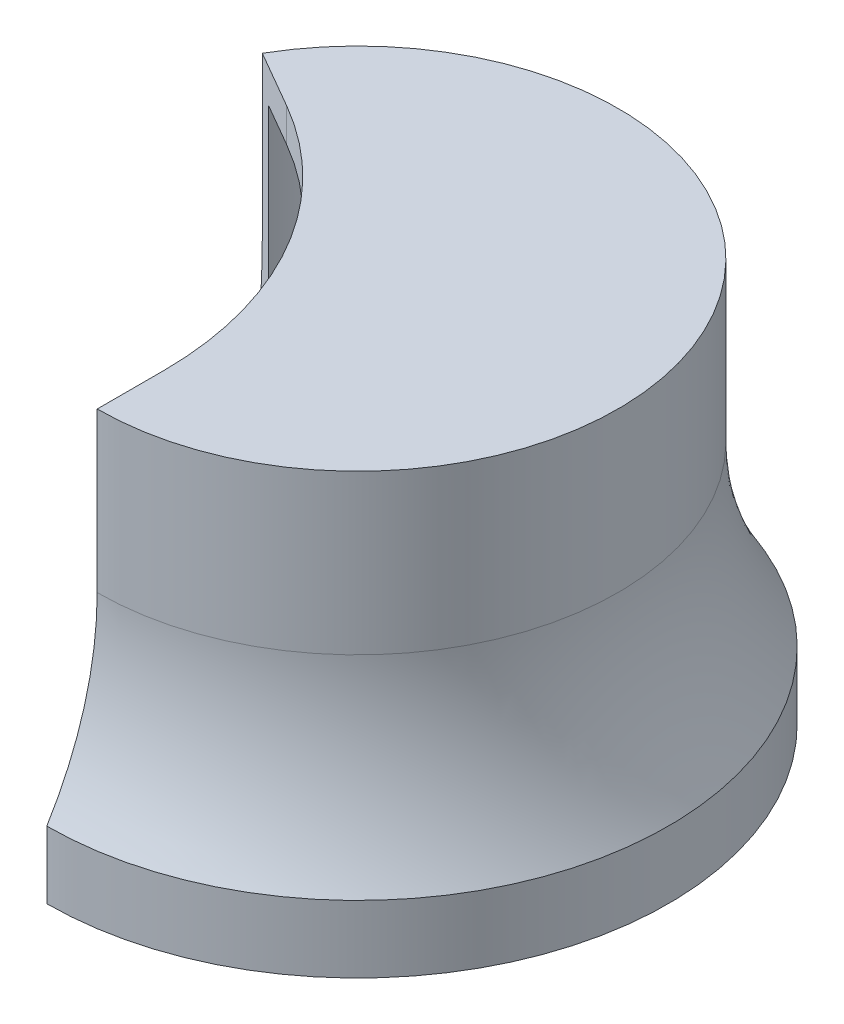
ISO-10303-21;
HEADER;
FILE_DESCRIPTION(('STEP AP214'),'2;1');
FILE_NAME('part.step','',(''),(''),'','','');
FILE_SCHEMA(('AUTOMOTIVE_DESIGN { 1 0 10303 214 1 1 1 1 }'));
ENDSEC;
DATA;
#1=APPLICATION_CONTEXT('core data for automotive mechanical design processes');
#2=APPLICATION_PROTOCOL_DEFINITION('international standard','automotive_design',2000,#1);
#3=PRODUCT_CONTEXT('',#1,'mechanical');
#4=PRODUCT('Part','Part','',(#3));
#5=PRODUCT_RELATED_PRODUCT_CATEGORY('part','',(#4));
#6=PRODUCT_DEFINITION_FORMATION('','',#4);
#7=PRODUCT_DEFINITION_CONTEXT('part definition',#1,'design');
#8=PRODUCT_DEFINITION('design','',#6,#7);
#9=PRODUCT_DEFINITION_SHAPE('','',#8);
#10=(LENGTH_UNIT() NAMED_UNIT(*) SI_UNIT(.MILLI.,.METRE.));
#11=(NAMED_UNIT(*) PLANE_ANGLE_UNIT() SI_UNIT($,.RADIAN.));
#12=(NAMED_UNIT(*) SI_UNIT($,.STERADIAN.) SOLID_ANGLE_UNIT());
#13=UNCERTAINTY_MEASURE_WITH_UNIT(LENGTH_MEASURE(1.E-05),#10,'distance_accuracy_value','');
#14=(GEOMETRIC_REPRESENTATION_CONTEXT(3) GLOBAL_UNCERTAINTY_ASSIGNED_CONTEXT((#13)) GLOBAL_UNIT_ASSIGNED_CONTEXT((#10,
#11,#12)) REPRESENTATION_CONTEXT('',''));
#15=CARTESIAN_POINT('',(0.,0.,0.));
#16=DIRECTION('',(0.,0.,1.));
#17=DIRECTION('',(1.,0.,0.));
#18=AXIS2_PLACEMENT_3D('',#15,#16,#17);
#19=CARTESIAN_POINT('',(0.,0.,0.));
#20=DIRECTION('',(0.,1.,0.));
#21=DIRECTION('',(0.,0.,1.));
#22=AXIS2_PLACEMENT_3D('',#19,#20,#21);
#23=PLANE('',#22);
#24=DIRECTION('',(0.,0.,1.));
#25=VECTOR('',#24,1.);
#26=CARTESIAN_POINT('',(0.,0.,0.));
#27=LINE('',#26,#25);
#28=CARTESIAN_POINT('',(0.,0.,14.5));
#29=VERTEX_POINT('',#28);
#30=CARTESIAN_POINT('',(0.,0.,17.));
#31=VERTEX_POINT('',#30);
#32=EDGE_CURVE('E138',#29,#31,#27,.T.);
#33=ORIENTED_EDGE('',*,*,#32,.F.);
#34=CARTESIAN_POINT('',(0.,0.,0.));
#35=DIRECTION('',(0.,1.,0.));
#36=DIRECTION('',(0.,0.,1.));
#37=AXIS2_PLACEMENT_3D('',#34,#35,#36);
#38=CIRCLE('',#37,14.5);
#39=CARTESIAN_POINT('',(-12.5573683548743,0.,-7.25000000000006));
#40=VERTEX_POINT('',#39);
#41=EDGE_CURVE('E133',#29,#40,#38,.T.);
#42=ORIENTED_EDGE('',*,*,#41,.T.);
#43=DIRECTION('',(-0.866025403784436,0.,-0.500000000000004));
#44=VECTOR('',#43,1.);
#45=CARTESIAN_POINT('',(0.,0.,0.));
#46=LINE('',#45,#44);
#47=CARTESIAN_POINT('',(-14.7224318643354,0.,-8.50000000000007));
#48=VERTEX_POINT('',#47);
#49=EDGE_CURVE('E116',#40,#48,#46,.T.);
#50=ORIENTED_EDGE('',*,*,#49,.T.);
#51=CARTESIAN_POINT('',(0.,0.,0.));
#52=DIRECTION('',(0.,1.,0.));
#53=DIRECTION('',(0.,0.,1.));
#54=AXIS2_PLACEMENT_3D('',#51,#52,#53);
#55=CIRCLE('',#54,17.);
#56=EDGE_CURVE('E143',#31,#48,#55,.T.);
#57=ORIENTED_EDGE('',*,*,#56,.F.);
#58=EDGE_LOOP('',(#33,#42,#50,#57));
#59=FACE_BOUND('',#58,.T.);
#60=ADVANCED_FACE('F41',(#59),#23,.F.);
#61=CARTESIAN_POINT('',(0.,2.,0.));
#62=DIRECTION('',(0.,-1.,0.));
#63=DIRECTION('',(0.,0.,-1.));
#64=AXIS2_PLACEMENT_3D('',#61,#62,#63);
#65=CYLINDRICAL_SURFACE('',#64,18.5);
#66=DIRECTION('',(0.,-1.,0.));
#67=VECTOR('',#66,1.);
#68=CARTESIAN_POINT('',(0.,2.,18.5));
#69=LINE('',#68,#67);
#70=CARTESIAN_POINT('',(0.,-2.,18.5));
#71=VERTEX_POINT('',#70);
#72=CARTESIAN_POINT('',(0.,2.,18.5));
#73=VERTEX_POINT('',#72);
#74=EDGE_CURVE('E187',#71,#73,#69,.F.);
#75=ORIENTED_EDGE('',*,*,#74,.F.);
#76=CARTESIAN_POINT('',(0.,-2.,0.));
#77=DIRECTION('',(0.,1.,0.));
#78=DIRECTION('',(0.,0.,1.));
#79=AXIS2_PLACEMENT_3D('',#76,#77,#78);
#80=CIRCLE('',#79,18.5);
#81=CARTESIAN_POINT('',(-16.0214699700121,-2.,-9.25000000000007));
#82=VERTEX_POINT('',#81);
#83=EDGE_CURVE('E140',#71,#82,#80,.T.);
#84=ORIENTED_EDGE('',*,*,#83,.T.);
#85=DIRECTION('',(0.,-1.,0.));
#86=VECTOR('',#85,1.);
#87=CARTESIAN_POINT('',(-16.0214699700121,2.,-9.25000000000007));
#88=LINE('',#87,#86);
#89=CARTESIAN_POINT('',(-16.0214699700121,2.,-9.25000000000007));
#90=VERTEX_POINT('',#89);
#91=EDGE_CURVE('E205',#82,#90,#88,.F.);
#92=ORIENTED_EDGE('',*,*,#91,.T.);
#93=CARTESIAN_POINT('',(0.,2.,0.));
#94=DIRECTION('',(0.,1.,0.));
#95=DIRECTION('',(0.,0.,1.));
#96=AXIS2_PLACEMENT_3D('',#93,#94,#95);
#97=CIRCLE('',#96,18.5);
#98=EDGE_CURVE('E139',#73,#90,#97,.T.);
#99=ORIENTED_EDGE('',*,*,#98,.F.);
#100=EDGE_LOOP('',(#75,#84,#92,#99));
#101=FACE_BOUND('',#100,.T.);
#102=ADVANCED_FACE('F220',(#101),#65,.T.);
#103=CARTESIAN_POINT('',(0.,2.,0.));
#104=DIRECTION('',(0.,-1.,0.));
#105=DIRECTION('',(0.,0.,-1.));
#106=AXIS2_PLACEMENT_3D('',#103,#104,#105);
#107=CYLINDRICAL_SURFACE('',#106,14.5);
#108=ORIENTED_EDGE('',*,*,#41,.F.);
#109=DIRECTION('',(0.,-1.,0.));
#110=VECTOR('',#109,1.);
#111=CARTESIAN_POINT('',(0.,2.,14.5));
#112=LINE('',#111,#110);
#113=CARTESIAN_POINT('',(0.,20.,14.5));
#114=VERTEX_POINT('',#113);
#115=EDGE_CURVE('E213',#29,#114,#112,.F.);
#116=ORIENTED_EDGE('',*,*,#115,.T.);
#117=CARTESIAN_POINT('',(0.,20.,0.));
#118=DIRECTION('',(0.,1.,0.));
#119=DIRECTION('',(0.,0.,1.));
#120=AXIS2_PLACEMENT_3D('',#117,#118,#119);
#121=CIRCLE('',#120,14.5);
#122=CARTESIAN_POINT('',(-12.5573683548743,20.,-7.25000000000006));
#123=VERTEX_POINT('',#122);
#124=EDGE_CURVE('E135',#114,#123,#121,.T.);
#125=ORIENTED_EDGE('',*,*,#124,.T.);
#126=DIRECTION('',(0.,-1.,0.));
#127=VECTOR('',#126,1.);
#128=CARTESIAN_POINT('',(-12.5573683548743,2.,-7.25000000000006));
#129=LINE('',#128,#127);
#130=EDGE_CURVE('E120',#40,#123,#129,.F.);
#131=ORIENTED_EDGE('',*,*,#130,.F.);
#132=EDGE_LOOP('',(#108,#116,#125,#131));
#133=FACE_BOUND('',#132,.T.);
#134=ADVANCED_FACE('F131',(#133),#107,.F.);
#135=CARTESIAN_POINT('',(0.,-2.,0.));
#136=DIRECTION('',(0.,1.,0.));
#137=DIRECTION('',(0.,0.,1.));
#138=AXIS2_PLACEMENT_3D('',#135,#136,#137);
#139=CYLINDRICAL_SURFACE('',#138,17.);
#140=DIRECTION('',(0.,1.,0.));
#141=VECTOR('',#140,1.);
#142=CARTESIAN_POINT('',(0.,-2.,17.));
#143=LINE('',#142,#141);
#144=CARTESIAN_POINT('',(0.,-2.,17.));
#145=VERTEX_POINT('',#144);
#146=EDGE_CURVE('E203',#31,#145,#143,.F.);
#147=ORIENTED_EDGE('',*,*,#146,.F.);
#148=ORIENTED_EDGE('',*,*,#56,.T.);
#149=DIRECTION('',(0.,1.,0.));
#150=VECTOR('',#149,1.);
#151=CARTESIAN_POINT('',(-14.7224318643354,-2.,-8.50000000000007));
#152=LINE('',#151,#150);
#153=CARTESIAN_POINT('',(-14.7224318643354,-2.,-8.50000000000007));
#154=VERTEX_POINT('',#153);
#155=EDGE_CURVE('E123',#48,#154,#152,.F.);
#156=ORIENTED_EDGE('',*,*,#155,.T.);
#157=CARTESIAN_POINT('',(0.,-2.,0.));
#158=DIRECTION('',(0.,1.,0.));
#159=DIRECTION('',(0.,0.,1.));
#160=AXIS2_PLACEMENT_3D('',#157,#158,#159);
#161=CIRCLE('',#160,17.);
#162=EDGE_CURVE('E146',#145,#154,#161,.T.);
#163=ORIENTED_EDGE('',*,*,#162,.F.);
#164=EDGE_LOOP('',(#147,#148,#156,#163));
#165=FACE_BOUND('',#164,.T.);
#166=ADVANCED_FACE('F202',(#165),#139,.F.);
#167=CARTESIAN_POINT('',(0.,-2.,0.));
#168=DIRECTION('',(0.,1.,0.));
#169=DIRECTION('',(0.,0.,1.));
#170=AXIS2_PLACEMENT_3D('',#167,#168,#169);
#171=PLANE('',#170);
#172=DIRECTION('',(0.,0.,1.));
#173=VECTOR('',#172,1.);
#174=CARTESIAN_POINT('',(0.,-2.,0.));
#175=LINE('',#174,#173);
#176=EDGE_CURVE('E199',#145,#71,#175,.T.);
#177=ORIENTED_EDGE('',*,*,#176,.F.);
#178=ORIENTED_EDGE('',*,*,#162,.T.);
#179=DIRECTION('',(-0.866025403784436,0.,-0.500000000000004));
#180=VECTOR('',#179,1.);
#181=CARTESIAN_POINT('',(0.,-2.,0.));
#182=LINE('',#181,#180);
#183=EDGE_CURVE('E198',#154,#82,#182,.T.);
#184=ORIENTED_EDGE('',*,*,#183,.T.);
#185=ORIENTED_EDGE('',*,*,#83,.F.);
#186=EDGE_LOOP('',(#177,#178,#184,#185));
#187=FACE_BOUND('',#186,.T.);
#188=ADVANCED_FACE('F196',(#187),#171,.F.);
#189=CARTESIAN_POINT('',(0.,20.,0.));
#190=DIRECTION('',(0.,-1.,0.));
#191=DIRECTION('',(0.,0.,-1.));
#192=AXIS2_PLACEMENT_3D('',#189,#190,#191);
#193=CYLINDRICAL_SURFACE('',#192,15.5);
#194=DIRECTION('',(0.,-1.,0.));
#195=VECTOR('',#194,1.);
#196=CARTESIAN_POINT('',(0.,20.,15.5));
#197=LINE('',#196,#195);
#198=CARTESIAN_POINT('',(0.,12.5356537528527,15.5));
#199=VERTEX_POINT('',#198);
#200=CARTESIAN_POINT('',(0.,22.,15.5));
#201=VERTEX_POINT('',#200);
#202=EDGE_CURVE('E183',#199,#201,#197,.F.);
#203=ORIENTED_EDGE('',*,*,#202,.F.);
#204=CARTESIAN_POINT('',(0.,12.5356537528527,0.));
#205=DIRECTION('',(0.,-1.,0.));
#206=DIRECTION('',(0.,0.,-1.));
#207=AXIS2_PLACEMENT_3D('',#204,#205,#206);
#208=CIRCLE('',#207,15.5);
#209=CARTESIAN_POINT('',(-13.4233937586588,12.5356537528527,-7.75000000000006));
#210=VERTEX_POINT('',#209);
#211=EDGE_CURVE('E56',#199,#210,#208,.F.);
#212=ORIENTED_EDGE('',*,*,#211,.T.);
#213=DIRECTION('',(0.,-1.,0.));
#214=VECTOR('',#213,1.);
#215=CARTESIAN_POINT('',(-13.4233937586588,20.,-7.75000000000006));
#216=LINE('',#215,#214);
#217=CARTESIAN_POINT('',(-13.4233937586588,22.,-7.75000000000006));
#218=VERTEX_POINT('',#217);
#219=EDGE_CURVE('E210',#210,#218,#216,.F.);
#220=ORIENTED_EDGE('',*,*,#219,.T.);
#221=CARTESIAN_POINT('',(0.,22.,0.));
#222=DIRECTION('',(0.,1.,0.));
#223=DIRECTION('',(0.,0.,1.));
#224=AXIS2_PLACEMENT_3D('',#221,#222,#223);
#225=CIRCLE('',#224,15.5);
#226=EDGE_CURVE('E184',#201,#218,#225,.T.);
#227=ORIENTED_EDGE('',*,*,#226,.F.);
#228=EDGE_LOOP('',(#203,#212,#220,#227));
#229=FACE_BOUND('',#228,.T.);
#230=ADVANCED_FACE('F223',(#229),#193,.T.);
#231=CARTESIAN_POINT('',(0.,22.,0.));
#232=DIRECTION('',(0.,1.,0.));
#233=DIRECTION('',(0.,0.,1.));
#234=AXIS2_PLACEMENT_3D('',#231,#232,#233);
#235=PLANE('',#234);
#236=DIRECTION('',(-0.866025403784436,0.,-0.500000000000004));
#237=VECTOR('',#236,1.);
#238=CARTESIAN_POINT('',(0.,22.,0.));
#239=LINE('',#238,#237);
#240=CARTESIAN_POINT('',(-9.99999999999992,22.,-5.77350269189627));
#241=VERTEX_POINT('',#240);
#242=EDGE_CURVE('E181',#241,#218,#239,.T.);
#243=ORIENTED_EDGE('',*,*,#242,.F.);
#244=CARTESIAN_POINT('',(-20.,22.,11.5470053837925));
#245=DIRECTION('',(0.,1.,0.));
#246=DIRECTION('',(0.,0.,1.));
#247=AXIS2_PLACEMENT_3D('',#244,#245,#246);
#248=CIRCLE('',#247,20.);
#249=CARTESIAN_POINT('',(0.,22.,11.5470053837925));
#250=VERTEX_POINT('',#249);
#251=EDGE_CURVE('E160',#241,#250,#248,.F.);
#252=ORIENTED_EDGE('',*,*,#251,.T.);
#253=DIRECTION('',(0.,0.,1.));
#254=VECTOR('',#253,1.);
#255=CARTESIAN_POINT('',(0.,22.,0.));
#256=LINE('',#255,#254);
#257=EDGE_CURVE('E179',#250,#201,#256,.T.);
#258=ORIENTED_EDGE('',*,*,#257,.T.);
#259=ORIENTED_EDGE('',*,*,#226,.T.);
#260=EDGE_LOOP('',(#243,#252,#258,#259));
#261=FACE_BOUND('',#260,.T.);
#262=ADVANCED_FACE('F177',(#261),#235,.T.);
#263=CARTESIAN_POINT('',(0.,20.,0.));
#264=DIRECTION('',(0.,1.,0.));
#265=DIRECTION('',(0.,0.,1.));
#266=AXIS2_PLACEMENT_3D('',#263,#264,#265);
#267=PLANE('',#266);
#268=DIRECTION('',(0.,0.,1.));
#269=VECTOR('',#268,1.);
#270=CARTESIAN_POINT('',(0.,20.,0.));
#271=LINE('',#270,#269);
#272=CARTESIAN_POINT('',(0.,20.,11.5470053837925));
#273=VERTEX_POINT('',#272);
#274=EDGE_CURVE('E153',#273,#114,#271,.T.);
#275=ORIENTED_EDGE('',*,*,#274,.F.);
#276=CARTESIAN_POINT('',(-20.,20.,11.5470053837925));
#277=DIRECTION('',(0.,1.,0.));
#278=DIRECTION('',(0.,0.,1.));
#279=AXIS2_PLACEMENT_3D('',#276,#277,#278);
#280=CIRCLE('',#279,20.);
#281=CARTESIAN_POINT('',(-9.99999999999992,20.,-5.77350269189627));
#282=VERTEX_POINT('',#281);
#283=EDGE_CURVE('E162',#273,#282,#280,.T.);
#284=ORIENTED_EDGE('',*,*,#283,.T.);
#285=DIRECTION('',(-0.866025403784436,0.,-0.500000000000004));
#286=VECTOR('',#285,1.);
#287=CARTESIAN_POINT('',(0.,20.,0.));
#288=LINE('',#287,#286);
#289=EDGE_CURVE('E151',#282,#123,#288,.T.);
#290=ORIENTED_EDGE('',*,*,#289,.T.);
#291=ORIENTED_EDGE('',*,*,#124,.F.);
#292=EDGE_LOOP('',(#275,#284,#290,#291));
#293=FACE_BOUND('',#292,.T.);
#294=ADVANCED_FACE('F167',(#293),#267,.F.);
#295=CARTESIAN_POINT('',(0.,-31.,0.));
#296=DIRECTION('',(-1.,0.,0.));
#297=DIRECTION('',(0.,0.,1.));
#298=AXIS2_PLACEMENT_3D('',#295,#296,#297);
#299=PLANE('',#298);
#300=ORIENTED_EDGE('',*,*,#257,.F.);
#301=DIRECTION('',(0.,1.,0.));
#302=VECTOR('',#301,1.);
#303=CARTESIAN_POINT('',(0.,-31.,11.5470053837925));
#304=LINE('',#303,#302);
#305=EDGE_CURVE('E158',#250,#273,#304,.F.);
#306=ORIENTED_EDGE('',*,*,#305,.T.);
#307=ORIENTED_EDGE('',*,*,#274,.T.);
#308=ORIENTED_EDGE('',*,*,#115,.F.);
#309=ORIENTED_EDGE('',*,*,#32,.T.);
#310=ORIENTED_EDGE('',*,*,#146,.T.);
#311=ORIENTED_EDGE('',*,*,#176,.T.);
#312=ORIENTED_EDGE('',*,*,#74,.T.);
#313=CARTESIAN_POINT('',(0.,12.5356537528527,35.5));
#314=DIRECTION('',(-1.,0.,0.));
#315=DIRECTION('',(0.,0.,1.));
#316=AXIS2_PLACEMENT_3D('',#313,#314,#315);
#317=CIRCLE('',#316,20.);
#318=EDGE_CURVE('E49',#73,#199,#317,.F.);
#319=ORIENTED_EDGE('',*,*,#318,.T.);
#320=ORIENTED_EDGE('',*,*,#202,.T.);
#321=EDGE_LOOP('',(#300,#306,#307,#308,#309,#310,#311,#312,#319,#320));
#322=FACE_BOUND('',#321,.T.);
#323=ADVANCED_FACE('F182',(#322),#299,.T.);
#324=CARTESIAN_POINT('',(0.,-31.,0.));
#325=DIRECTION('',(0.500000000000004,0.,-0.866025403784436));
#326=DIRECTION('',(-0.866025403784436,0.,-0.500000000000004));
#327=AXIS2_PLACEMENT_3D('',#324,#325,#326);
#328=PLANE('',#327);
#329=ORIENTED_EDGE('',*,*,#289,.F.);
#330=DIRECTION('',(0.,1.,0.));
#331=VECTOR('',#330,1.);
#332=CARTESIAN_POINT('',(-9.99999999999992,-31.,-5.77350269189627));
#333=LINE('',#332,#331);
#334=EDGE_CURVE('E155',#282,#241,#333,.T.);
#335=ORIENTED_EDGE('',*,*,#334,.T.);
#336=ORIENTED_EDGE('',*,*,#242,.T.);
#337=ORIENTED_EDGE('',*,*,#219,.F.);
#338=CARTESIAN_POINT('',(-30.7439018343475,12.5356537528527,-17.7500000000001));
#339=DIRECTION('',(0.500000000000004,0.,-0.866025403784436));
#340=DIRECTION('',(-0.866025403784436,0.,-0.500000000000004));
#341=AXIS2_PLACEMENT_3D('',#338,#339,#340);
#342=CIRCLE('',#341,20.);
#343=EDGE_CURVE('E12',#210,#90,#342,.T.);
#344=ORIENTED_EDGE('',*,*,#343,.T.);
#345=ORIENTED_EDGE('',*,*,#91,.F.);
#346=ORIENTED_EDGE('',*,*,#183,.F.);
#347=ORIENTED_EDGE('',*,*,#155,.F.);
#348=ORIENTED_EDGE('',*,*,#49,.F.);
#349=ORIENTED_EDGE('',*,*,#130,.T.);
#350=EDGE_LOOP('',(#329,#335,#336,#337,#344,#345,#346,#347,#348,#349));
#351=FACE_BOUND('',#350,.T.);
#352=ADVANCED_FACE('F119',(#351),#328,.F.);
#353=CARTESIAN_POINT('',(-20.,-31.,11.5470053837925));
#354=DIRECTION('',(0.,1.,0.));
#355=DIRECTION('',(0.,0.,1.));
#356=AXIS2_PLACEMENT_3D('',#353,#354,#355);
#357=CYLINDRICAL_SURFACE('',#356,20.);
#358=ORIENTED_EDGE('',*,*,#283,.F.);
#359=ORIENTED_EDGE('',*,*,#305,.F.);
#360=ORIENTED_EDGE('',*,*,#251,.F.);
#361=ORIENTED_EDGE('',*,*,#334,.F.);
#362=EDGE_LOOP('',(#358,#359,#360,#361));
#363=FACE_BOUND('',#362,.T.);
#364=ADVANCED_FACE('F173',(#363),#357,.F.);
#365=CARTESIAN_POINT('',(0.,12.5356537528527,0.));
#366=DIRECTION('',(0.,-1.,0.));
#367=DIRECTION('',(0.,0.,-1.));
#368=AXIS2_PLACEMENT_3D('',#365,#366,#367);
#369=TOROIDAL_SURFACE('',#368,35.5,20.);
#370=ORIENTED_EDGE('',*,*,#343,.F.);
#371=ORIENTED_EDGE('',*,*,#211,.F.);
#372=ORIENTED_EDGE('',*,*,#318,.F.);
#373=ORIENTED_EDGE('',*,*,#98,.T.);
#374=EDGE_LOOP('',(#370,#371,#372,#373));
#375=FACE_BOUND('',#374,.T.);
#376=ADVANCED_FACE('F43',(#375),#369,.F.);
#377=CLOSED_SHELL('',(#60,#102,#134,#166,#188,#230,#262,#294,#323,#352,#364,#376));
#378=MANIFOLD_SOLID_BREP('B2',#377);
#379=ADVANCED_BREP_SHAPE_REPRESENTATION('',(#18,#378),#14);
#380=SHAPE_DEFINITION_REPRESENTATION(#9,#379);
ENDSEC;
END-ISO-10303-21;
